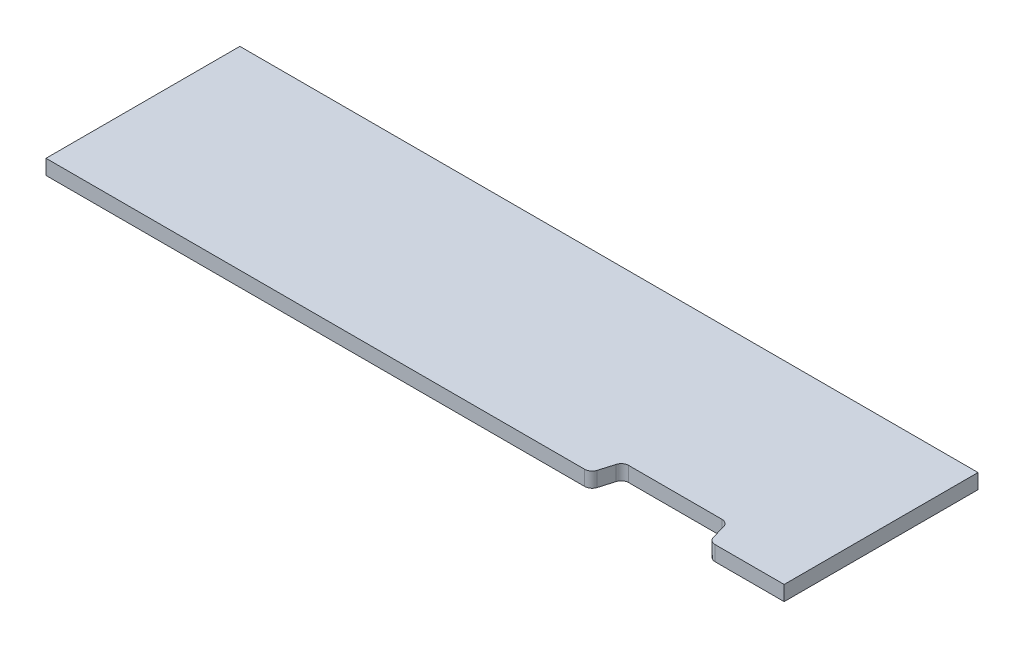
ISO-10303-21;
HEADER;
FILE_DESCRIPTION(('STEP AP214'),'2;1');
FILE_NAME('part.step','',(''),(''),'','','');
FILE_SCHEMA(('AUTOMOTIVE_DESIGN { 1 0 10303 214 1 1 1 1 }'));
ENDSEC;
DATA;
#1=APPLICATION_CONTEXT('core data for automotive mechanical design processes');
#2=APPLICATION_PROTOCOL_DEFINITION('international standard','automotive_design',2000,#1);
#3=PRODUCT_CONTEXT('',#1,'mechanical');
#4=PRODUCT('Part','Part','',(#3));
#5=PRODUCT_RELATED_PRODUCT_CATEGORY('part','',(#4));
#6=PRODUCT_DEFINITION_FORMATION('','',#4);
#7=PRODUCT_DEFINITION_CONTEXT('part definition',#1,'design');
#8=PRODUCT_DEFINITION('design','',#6,#7);
#9=PRODUCT_DEFINITION_SHAPE('','',#8);
#10=(LENGTH_UNIT() NAMED_UNIT(*) SI_UNIT(.MILLI.,.METRE.));
#11=(NAMED_UNIT(*) PLANE_ANGLE_UNIT() SI_UNIT($,.RADIAN.));
#12=(NAMED_UNIT(*) SI_UNIT($,.STERADIAN.) SOLID_ANGLE_UNIT());
#13=UNCERTAINTY_MEASURE_WITH_UNIT(LENGTH_MEASURE(1.E-05),#10,'distance_accuracy_value','');
#14=(GEOMETRIC_REPRESENTATION_CONTEXT(3) GLOBAL_UNCERTAINTY_ASSIGNED_CONTEXT((#13)) GLOBAL_UNIT_ASSIGNED_CONTEXT((#10,
#11,#12)) REPRESENTATION_CONTEXT('',''));
#15=CARTESIAN_POINT('',(0.,0.,0.));
#16=DIRECTION('',(0.,0.,1.));
#17=DIRECTION('',(1.,0.,0.));
#18=AXIS2_PLACEMENT_3D('',#15,#16,#17);
#19=CARTESIAN_POINT('',(-314.325,12.7,82.55));
#20=DIRECTION('',(0.,0.,-1.));
#21=DIRECTION('',(-1.,0.,0.));
#22=AXIS2_PLACEMENT_3D('',#19,#20,#21);
#23=PLANE('',#22);
#24=DIRECTION('',(1.,0.,0.));
#25=VECTOR('',#24,1.);
#26=CARTESIAN_POINT('',(-314.325,0.,82.55));
#27=LINE('',#26,#25);
#28=CARTESIAN_POINT('',(-314.325,0.,82.55));
#29=VERTEX_POINT('',#28);
#30=CARTESIAN_POINT('',(144.473689018744,0.,82.55));
#31=VERTEX_POINT('',#30);
#32=EDGE_CURVE('E142',#29,#31,#27,.T.);
#33=ORIENTED_EDGE('',*,*,#32,.T.);
#34=DIRECTION('',(0.,-1.,0.));
#35=VECTOR('',#34,1.);
#36=CARTESIAN_POINT('',(144.473689018744,12.7,82.55));
#37=LINE('',#36,#35);
#38=CARTESIAN_POINT('',(144.473689018744,12.7,82.55));
#39=VERTEX_POINT('',#38);
#40=EDGE_CURVE('E177',#31,#39,#37,.F.);
#41=ORIENTED_EDGE('',*,*,#40,.T.);
#42=DIRECTION('',(1.,0.,0.));
#43=VECTOR('',#42,1.);
#44=CARTESIAN_POINT('',(-314.325,12.7,82.55));
#45=LINE('',#44,#43);
#46=CARTESIAN_POINT('',(-314.325,12.7,82.55));
#47=VERTEX_POINT('',#46);
#48=EDGE_CURVE('E213',#47,#39,#45,.T.);
#49=ORIENTED_EDGE('',*,*,#48,.F.);
#50=DIRECTION('',(0.,-1.,0.));
#51=VECTOR('',#50,1.);
#52=CARTESIAN_POINT('',(-314.325,12.7,82.55));
#53=LINE('',#52,#51);
#54=EDGE_CURVE('E152',#47,#29,#53,.T.);
#55=ORIENTED_EDGE('',*,*,#54,.T.);
#56=EDGE_LOOP('',(#33,#41,#49,#55));
#57=FACE_BOUND('',#56,.T.);
#58=ADVANCED_FACE('F33',(#57),#23,.F.);
#59=CARTESIAN_POINT('',(314.325,12.7,82.55));
#60=DIRECTION('',(-1.,0.,0.));
#61=DIRECTION('',(0.,0.,1.));
#62=AXIS2_PLACEMENT_3D('',#59,#60,#61);
#63=PLANE('',#62);
#64=DIRECTION('',(0.,0.,-1.));
#65=VECTOR('',#64,1.);
#66=CARTESIAN_POINT('',(314.325,0.,82.55));
#67=LINE('',#66,#65);
#68=CARTESIAN_POINT('',(314.325,0.,82.55));
#69=VERTEX_POINT('',#68);
#70=CARTESIAN_POINT('',(314.325,0.,-82.55));
#71=VERTEX_POINT('',#70);
#72=EDGE_CURVE('E146',#69,#71,#67,.T.);
#73=ORIENTED_EDGE('',*,*,#72,.T.);
#74=DIRECTION('',(0.,-1.,0.));
#75=VECTOR('',#74,1.);
#76=CARTESIAN_POINT('',(314.325,12.7,-82.55));
#77=LINE('',#76,#75);
#78=CARTESIAN_POINT('',(314.325,12.7,-82.55));
#79=VERTEX_POINT('',#78);
#80=EDGE_CURVE('E126',#79,#71,#77,.T.);
#81=ORIENTED_EDGE('',*,*,#80,.F.);
#82=DIRECTION('',(0.,0.,-1.));
#83=VECTOR('',#82,1.);
#84=CARTESIAN_POINT('',(314.325,12.7,82.55));
#85=LINE('',#84,#83);
#86=CARTESIAN_POINT('',(314.325,12.7,82.55));
#87=VERTEX_POINT('',#86);
#88=EDGE_CURVE('E132',#87,#79,#85,.T.);
#89=ORIENTED_EDGE('',*,*,#88,.F.);
#90=DIRECTION('',(0.,-1.,0.));
#91=VECTOR('',#90,1.);
#92=CARTESIAN_POINT('',(314.325,12.7,82.55));
#93=LINE('',#92,#91);
#94=EDGE_CURVE('E216',#87,#69,#93,.T.);
#95=ORIENTED_EDGE('',*,*,#94,.T.);
#96=EDGE_LOOP('',(#73,#81,#89,#95));
#97=FACE_BOUND('',#96,.T.);
#98=ADVANCED_FACE('F144',(#97),#63,.F.);
#99=CARTESIAN_POINT('',(-314.325,12.7,-82.55));
#100=DIRECTION('',(0.,0.,1.));
#101=DIRECTION('',(1.,0.,0.));
#102=AXIS2_PLACEMENT_3D('',#99,#100,#101);
#103=PLANE('',#102);
#104=DIRECTION('',(-1.,0.,0.));
#105=VECTOR('',#104,1.);
#106=CARTESIAN_POINT('',(-314.325,0.,-82.55));
#107=LINE('',#106,#105);
#108=CARTESIAN_POINT('',(-314.325,0.,-82.55));
#109=VERTEX_POINT('',#108);
#110=EDGE_CURVE('E218',#71,#109,#107,.T.);
#111=ORIENTED_EDGE('',*,*,#110,.T.);
#112=DIRECTION('',(0.,-1.,0.));
#113=VECTOR('',#112,1.);
#114=CARTESIAN_POINT('',(-314.325,12.7,-82.55));
#115=LINE('',#114,#113);
#116=CARTESIAN_POINT('',(-314.325,12.7,-82.55));
#117=VERTEX_POINT('',#116);
#118=EDGE_CURVE('E129',#117,#109,#115,.T.);
#119=ORIENTED_EDGE('',*,*,#118,.F.);
#120=DIRECTION('',(-1.,0.,0.));
#121=VECTOR('',#120,1.);
#122=CARTESIAN_POINT('',(-314.325,12.7,-82.55));
#123=LINE('',#122,#121);
#124=EDGE_CURVE('E122',#79,#117,#123,.T.);
#125=ORIENTED_EDGE('',*,*,#124,.F.);
#126=ORIENTED_EDGE('',*,*,#80,.T.);
#127=EDGE_LOOP('',(#111,#119,#125,#126));
#128=FACE_BOUND('',#127,.T.);
#129=ADVANCED_FACE('F124',(#128),#103,.F.);
#130=CARTESIAN_POINT('',(-314.325,12.7,82.55));
#131=DIRECTION('',(1.,0.,0.));
#132=DIRECTION('',(0.,0.,-1.));
#133=AXIS2_PLACEMENT_3D('',#130,#131,#132);
#134=PLANE('',#133);
#135=DIRECTION('',(0.,0.,1.));
#136=VECTOR('',#135,1.);
#137=CARTESIAN_POINT('',(-314.325,0.,82.55));
#138=LINE('',#137,#136);
#139=EDGE_CURVE('E220',#109,#29,#138,.T.);
#140=ORIENTED_EDGE('',*,*,#139,.T.);
#141=ORIENTED_EDGE('',*,*,#54,.F.);
#142=DIRECTION('',(0.,0.,1.));
#143=VECTOR('',#142,1.);
#144=CARTESIAN_POINT('',(-314.325,12.7,82.55));
#145=LINE('',#144,#143);
#146=EDGE_CURVE('E131',#117,#47,#145,.T.);
#147=ORIENTED_EDGE('',*,*,#146,.F.);
#148=ORIENTED_EDGE('',*,*,#118,.T.);
#149=EDGE_LOOP('',(#140,#141,#147,#148));
#150=FACE_BOUND('',#149,.T.);
#151=ADVANCED_FACE('F235',(#150),#134,.F.);
#152=CARTESIAN_POINT('',(255.576310981256,12.7,82.55));
#153=VERTEX_POINT('',#152);
#154=EDGE_CURVE('E138',#153,#87,#45,.T.);
#155=ORIENTED_EDGE('',*,*,#154,.F.);
#156=DIRECTION('',(0.,-1.,0.));
#157=VECTOR('',#156,1.);
#158=CARTESIAN_POINT('',(255.576310981256,12.7,82.55));
#159=LINE('',#158,#157);
#160=CARTESIAN_POINT('',(255.576310981256,0.,82.55));
#161=VERTEX_POINT('',#160);
#162=EDGE_CURVE('E147',#153,#161,#159,.T.);
#163=ORIENTED_EDGE('',*,*,#162,.T.);
#164=EDGE_CURVE('E222',#161,#69,#27,.T.);
#165=ORIENTED_EDGE('',*,*,#164,.T.);
#166=ORIENTED_EDGE('',*,*,#94,.F.);
#167=EDGE_LOOP('',(#155,#163,#165,#166));
#168=FACE_BOUND('',#167,.T.);
#169=ADVANCED_FACE('F237',(#168),#23,.F.);
#170=CARTESIAN_POINT('',(0.,12.7,0.));
#171=DIRECTION('',(0.,-1.,0.));
#172=DIRECTION('',(0.,0.,-1.));
#173=AXIS2_PLACEMENT_3D('',#170,#171,#172);
#174=PLANE('',#173);
#175=DIRECTION('',(0.282166323991551,0.,0.95936550157127));
#176=VECTOR('',#175,1.);
#177=CARTESIAN_POINT('',(250.825,12.7,82.55));
#178=LINE('',#177,#176);
#179=CARTESIAN_POINT('',(245.815659953722,12.7,65.5182438426536));
#180=VERTEX_POINT('',#179);
#181=CARTESIAN_POINT('',(249.484340046278,12.7,77.9917561573464));
#182=VERTEX_POINT('',#181);
#183=EDGE_CURVE('E202',#180,#182,#178,.T.);
#184=ORIENTED_EDGE('',*,*,#183,.T.);
#185=CARTESIAN_POINT('',(255.576310981256,12.7,76.2));
#186=DIRECTION('',(0.,-1.,0.));
#187=DIRECTION('',(0.,0.,-1.));
#188=AXIS2_PLACEMENT_3D('',#185,#186,#187);
#189=CIRCLE('',#188,6.35);
#190=EDGE_CURVE('E166',#182,#153,#189,.F.);
#191=ORIENTED_EDGE('',*,*,#190,.T.);
#192=ORIENTED_EDGE('',*,*,#154,.T.);
#193=ORIENTED_EDGE('',*,*,#88,.T.);
#194=ORIENTED_EDGE('',*,*,#124,.T.);
#195=ORIENTED_EDGE('',*,*,#146,.T.);
#196=ORIENTED_EDGE('',*,*,#48,.T.);
#197=CARTESIAN_POINT('',(144.473689018744,12.7,76.2));
#198=DIRECTION('',(0.,-1.,0.));
#199=DIRECTION('',(0.,0.,-1.));
#200=AXIS2_PLACEMENT_3D('',#197,#198,#199);
#201=CIRCLE('',#200,6.35);
#202=CARTESIAN_POINT('',(150.565659953722,12.7,77.9917561573464));
#203=VERTEX_POINT('',#202);
#204=EDGE_CURVE('E164',#39,#203,#201,.F.);
#205=ORIENTED_EDGE('',*,*,#204,.T.);
#206=DIRECTION('',(0.282166323991551,0.,-0.95936550157127));
#207=VECTOR('',#206,1.);
#208=CARTESIAN_POINT('',(155.575,12.7,60.96));
#209=LINE('',#208,#207);
#210=CARTESIAN_POINT('',(154.234340046278,12.7,65.5182438426536));
#211=VERTEX_POINT('',#210);
#212=EDGE_CURVE('E203',#203,#211,#209,.T.);
#213=ORIENTED_EDGE('',*,*,#212,.T.);
#214=CARTESIAN_POINT('',(160.326310981256,12.7,67.31));
#215=DIRECTION('',(0.,-1.,0.));
#216=DIRECTION('',(0.,0.,-1.));
#217=AXIS2_PLACEMENT_3D('',#214,#215,#216);
#218=CIRCLE('',#217,6.35);
#219=CARTESIAN_POINT('',(160.326310981256,12.7,60.96));
#220=VERTEX_POINT('',#219);
#221=EDGE_CURVE('E11',#211,#220,#218,.T.);
#222=ORIENTED_EDGE('',*,*,#221,.T.);
#223=DIRECTION('',(1.,0.,0.));
#224=VECTOR('',#223,1.);
#225=CARTESIAN_POINT('',(244.475,12.7,60.96));
#226=LINE('',#225,#224);
#227=CARTESIAN_POINT('',(239.723689018744,12.7,60.96));
#228=VERTEX_POINT('',#227);
#229=EDGE_CURVE('E200',#220,#228,#226,.T.);
#230=ORIENTED_EDGE('',*,*,#229,.T.);
#231=CARTESIAN_POINT('',(239.723689018744,12.7,67.31));
#232=DIRECTION('',(0.,-1.,0.));
#233=DIRECTION('',(0.,0.,-1.));
#234=AXIS2_PLACEMENT_3D('',#231,#232,#233);
#235=CIRCLE('',#234,6.35);
#236=EDGE_CURVE('E181',#228,#180,#235,.T.);
#237=ORIENTED_EDGE('',*,*,#236,.T.);
#238=EDGE_LOOP('',(#184,#191,#192,#193,#194,#195,#196,#205,#213,#222,#230,#237));
#239=FACE_BOUND('',#238,.T.);
#240=ADVANCED_FACE('F136',(#239),#174,.F.);
#241=CARTESIAN_POINT('',(0.,0.,0.));
#242=DIRECTION('',(0.,-1.,0.));
#243=DIRECTION('',(0.,0.,-1.));
#244=AXIS2_PLACEMENT_3D('',#241,#242,#243);
#245=PLANE('',#244);
#246=ORIENTED_EDGE('',*,*,#164,.F.);
#247=CARTESIAN_POINT('',(255.576310981256,0.,76.2));
#248=DIRECTION('',(0.,-1.,0.));
#249=DIRECTION('',(0.,0.,-1.));
#250=AXIS2_PLACEMENT_3D('',#247,#248,#249);
#251=CIRCLE('',#250,6.35);
#252=CARTESIAN_POINT('',(249.484340046278,0.,77.9917561573464));
#253=VERTEX_POINT('',#252);
#254=EDGE_CURVE('E157',#161,#253,#251,.T.);
#255=ORIENTED_EDGE('',*,*,#254,.T.);
#256=DIRECTION('',(0.282166323991551,0.,0.95936550157127));
#257=VECTOR('',#256,1.);
#258=CARTESIAN_POINT('',(250.825,0.,82.55));
#259=LINE('',#258,#257);
#260=CARTESIAN_POINT('',(245.815659953722,0.,65.5182438426536));
#261=VERTEX_POINT('',#260);
#262=EDGE_CURVE('E206',#261,#253,#259,.T.);
#263=ORIENTED_EDGE('',*,*,#262,.F.);
#264=CARTESIAN_POINT('',(239.723689018744,0.,67.31));
#265=DIRECTION('',(0.,-1.,0.));
#266=DIRECTION('',(0.,0.,-1.));
#267=AXIS2_PLACEMENT_3D('',#264,#265,#266);
#268=CIRCLE('',#267,6.35);
#269=CARTESIAN_POINT('',(239.723689018744,0.,60.96));
#270=VERTEX_POINT('',#269);
#271=EDGE_CURVE('E179',#261,#270,#268,.F.);
#272=ORIENTED_EDGE('',*,*,#271,.T.);
#273=DIRECTION('',(1.,0.,0.));
#274=VECTOR('',#273,1.);
#275=CARTESIAN_POINT('',(244.475,0.,60.96));
#276=LINE('',#275,#274);
#277=CARTESIAN_POINT('',(160.326310981256,0.,60.96));
#278=VERTEX_POINT('',#277);
#279=EDGE_CURVE('E189',#278,#270,#276,.T.);
#280=ORIENTED_EDGE('',*,*,#279,.F.);
#281=CARTESIAN_POINT('',(160.326310981256,0.,67.31));
#282=DIRECTION('',(0.,-1.,0.));
#283=DIRECTION('',(0.,0.,-1.));
#284=AXIS2_PLACEMENT_3D('',#281,#282,#283);
#285=CIRCLE('',#284,6.35);
#286=CARTESIAN_POINT('',(154.234340046278,0.,65.5182438426536));
#287=VERTEX_POINT('',#286);
#288=EDGE_CURVE('E41',#278,#287,#285,.F.);
#289=ORIENTED_EDGE('',*,*,#288,.T.);
#290=DIRECTION('',(0.282166323991551,0.,-0.95936550157127));
#291=VECTOR('',#290,1.);
#292=CARTESIAN_POINT('',(155.575,0.,60.96));
#293=LINE('',#292,#291);
#294=CARTESIAN_POINT('',(150.565659953722,0.,77.9917561573464));
#295=VERTEX_POINT('',#294);
#296=EDGE_CURVE('E188',#295,#287,#293,.T.);
#297=ORIENTED_EDGE('',*,*,#296,.F.);
#298=CARTESIAN_POINT('',(144.473689018744,0.,76.2));
#299=DIRECTION('',(0.,-1.,0.));
#300=DIRECTION('',(0.,0.,-1.));
#301=AXIS2_PLACEMENT_3D('',#298,#299,#300);
#302=CIRCLE('',#301,6.35);
#303=EDGE_CURVE('E150',#295,#31,#302,.T.);
#304=ORIENTED_EDGE('',*,*,#303,.T.);
#305=ORIENTED_EDGE('',*,*,#32,.F.);
#306=ORIENTED_EDGE('',*,*,#139,.F.);
#307=ORIENTED_EDGE('',*,*,#110,.F.);
#308=ORIENTED_EDGE('',*,*,#72,.F.);
#309=EDGE_LOOP('',(#246,#255,#263,#272,#280,#289,#297,#304,#305,#306,#307,#308));
#310=FACE_BOUND('',#309,.T.);
#311=ADVANCED_FACE('F187',(#310),#245,.T.);
#312=CARTESIAN_POINT('',(155.575,12.7,60.96));
#313=DIRECTION('',(-0.95936550157127,0.,-0.282166323991551));
#314=DIRECTION('',(-0.282166323991551,0.,0.95936550157127));
#315=AXIS2_PLACEMENT_3D('',#312,#313,#314);
#316=PLANE('',#315);
#317=ORIENTED_EDGE('',*,*,#296,.T.);
#318=DIRECTION('',(0.,-1.,0.));
#319=VECTOR('',#318,1.);
#320=CARTESIAN_POINT('',(154.234340046278,12.7,65.5182438426536));
#321=LINE('',#320,#319);
#322=EDGE_CURVE('E175',#287,#211,#321,.F.);
#323=ORIENTED_EDGE('',*,*,#322,.T.);
#324=ORIENTED_EDGE('',*,*,#212,.F.);
#325=DIRECTION('',(0.,-1.,0.));
#326=VECTOR('',#325,1.);
#327=CARTESIAN_POINT('',(150.565659953722,12.7,77.9917561573464));
#328=LINE('',#327,#326);
#329=EDGE_CURVE('E172',#203,#295,#328,.T.);
#330=ORIENTED_EDGE('',*,*,#329,.T.);
#331=EDGE_LOOP('',(#317,#323,#324,#330));
#332=FACE_BOUND('',#331,.T.);
#333=ADVANCED_FACE('F194',(#332),#316,.F.);
#334=CARTESIAN_POINT('',(250.825,12.7,82.55));
#335=DIRECTION('',(0.95936550157127,0.,-0.282166323991551));
#336=DIRECTION('',(-0.282166323991551,0.,-0.95936550157127));
#337=AXIS2_PLACEMENT_3D('',#334,#335,#336);
#338=PLANE('',#337);
#339=ORIENTED_EDGE('',*,*,#262,.T.);
#340=DIRECTION('',(0.,-1.,0.));
#341=VECTOR('',#340,1.);
#342=CARTESIAN_POINT('',(249.484340046278,12.7,77.9917561573464));
#343=LINE('',#342,#341);
#344=EDGE_CURVE('E162',#253,#182,#343,.F.);
#345=ORIENTED_EDGE('',*,*,#344,.T.);
#346=ORIENTED_EDGE('',*,*,#183,.F.);
#347=DIRECTION('',(0.,-1.,0.));
#348=VECTOR('',#347,1.);
#349=CARTESIAN_POINT('',(245.815659953722,0.,65.5182438426536));
#350=LINE('',#349,#348);
#351=EDGE_CURVE('E159',#180,#261,#350,.T.);
#352=ORIENTED_EDGE('',*,*,#351,.T.);
#353=EDGE_LOOP('',(#339,#345,#346,#352));
#354=FACE_BOUND('',#353,.T.);
#355=ADVANCED_FACE('F259',(#354),#338,.F.);
#356=CARTESIAN_POINT('',(244.475,12.7,60.96));
#357=DIRECTION('',(0.,0.,-1.));
#358=DIRECTION('',(-1.,0.,0.));
#359=AXIS2_PLACEMENT_3D('',#356,#357,#358);
#360=PLANE('',#359);
#361=ORIENTED_EDGE('',*,*,#279,.T.);
#362=DIRECTION('',(0.,-1.,0.));
#363=VECTOR('',#362,1.);
#364=CARTESIAN_POINT('',(239.723689018744,12.7,60.96));
#365=LINE('',#364,#363);
#366=EDGE_CURVE('E48',#270,#228,#365,.F.);
#367=ORIENTED_EDGE('',*,*,#366,.T.);
#368=ORIENTED_EDGE('',*,*,#229,.F.);
#369=DIRECTION('',(0.,-1.,0.));
#370=VECTOR('',#369,1.);
#371=CARTESIAN_POINT('',(160.326310981256,0.,60.96));
#372=LINE('',#371,#370);
#373=EDGE_CURVE('E168',#220,#278,#372,.T.);
#374=ORIENTED_EDGE('',*,*,#373,.T.);
#375=EDGE_LOOP('',(#361,#367,#368,#374));
#376=FACE_BOUND('',#375,.T.);
#377=ADVANCED_FACE('F199',(#376),#360,.F.);
#378=CARTESIAN_POINT('',(255.576310981256,12.7,76.2));
#379=DIRECTION('',(0.,-1.,0.));
#380=DIRECTION('',(0.,0.,-1.));
#381=AXIS2_PLACEMENT_3D('',#378,#379,#380);
#382=CYLINDRICAL_SURFACE('',#381,6.35);
#383=ORIENTED_EDGE('',*,*,#190,.F.);
#384=ORIENTED_EDGE('',*,*,#344,.F.);
#385=ORIENTED_EDGE('',*,*,#254,.F.);
#386=ORIENTED_EDGE('',*,*,#162,.F.);
#387=EDGE_LOOP('',(#383,#384,#385,#386));
#388=FACE_BOUND('',#387,.T.);
#389=ADVANCED_FACE('F262',(#388),#382,.T.);
#390=CARTESIAN_POINT('',(239.723689018744,12.7,67.31));
#391=DIRECTION('',(0.,1.,0.));
#392=DIRECTION('',(0.,0.,1.));
#393=AXIS2_PLACEMENT_3D('',#390,#391,#392);
#394=CYLINDRICAL_SURFACE('',#393,6.35);
#395=ORIENTED_EDGE('',*,*,#236,.F.);
#396=ORIENTED_EDGE('',*,*,#366,.F.);
#397=ORIENTED_EDGE('',*,*,#271,.F.);
#398=ORIENTED_EDGE('',*,*,#351,.F.);
#399=EDGE_LOOP('',(#395,#396,#397,#398));
#400=FACE_BOUND('',#399,.T.);
#401=ADVANCED_FACE('F275',(#400),#394,.F.);
#402=CARTESIAN_POINT('',(160.326310981256,12.7,67.31));
#403=DIRECTION('',(0.,1.,0.));
#404=DIRECTION('',(0.,0.,1.));
#405=AXIS2_PLACEMENT_3D('',#402,#403,#404);
#406=CYLINDRICAL_SURFACE('',#405,6.35);
#407=ORIENTED_EDGE('',*,*,#221,.F.);
#408=ORIENTED_EDGE('',*,*,#322,.F.);
#409=ORIENTED_EDGE('',*,*,#288,.F.);
#410=ORIENTED_EDGE('',*,*,#373,.F.);
#411=EDGE_LOOP('',(#407,#408,#409,#410));
#412=FACE_BOUND('',#411,.T.);
#413=ADVANCED_FACE('F198',(#412),#406,.F.);
#414=CARTESIAN_POINT('',(144.473689018744,12.7,76.2));
#415=DIRECTION('',(0.,-1.,0.));
#416=DIRECTION('',(0.,0.,-1.));
#417=AXIS2_PLACEMENT_3D('',#414,#415,#416);
#418=CYLINDRICAL_SURFACE('',#417,6.35);
#419=ORIENTED_EDGE('',*,*,#204,.F.);
#420=ORIENTED_EDGE('',*,*,#40,.F.);
#421=ORIENTED_EDGE('',*,*,#303,.F.);
#422=ORIENTED_EDGE('',*,*,#329,.F.);
#423=EDGE_LOOP('',(#419,#420,#421,#422));
#424=FACE_BOUND('',#423,.T.);
#425=ADVANCED_FACE('F35',(#424),#418,.T.);
#426=CLOSED_SHELL('',(#58,#98,#129,#151,#169,#240,#311,#333,#355,#377,#389,#401,#413,#425));
#427=MANIFOLD_SOLID_BREP('B2',#426);
#428=ADVANCED_BREP_SHAPE_REPRESENTATION('',(#18,#427),#14);
#429=SHAPE_DEFINITION_REPRESENTATION(#9,#428);
ENDSEC;
END-ISO-10303-21;
